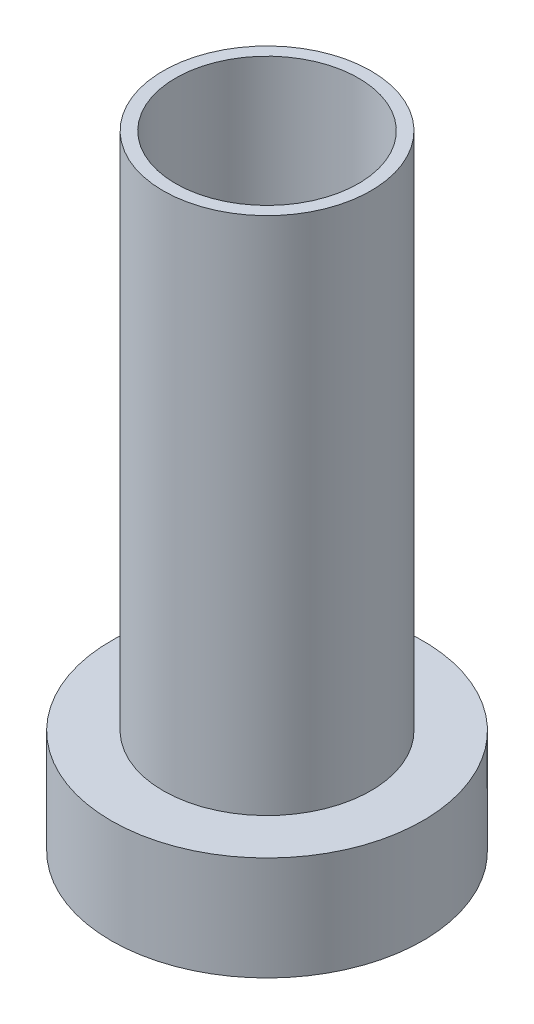
ISO-10303-21;
HEADER;
FILE_DESCRIPTION(('STEP AP214'),'2;1');
FILE_NAME('part.step','',(''),(''),'','','');
FILE_SCHEMA(('AUTOMOTIVE_DESIGN { 1 0 10303 214 1 1 1 1 }'));
ENDSEC;
DATA;
#1=APPLICATION_CONTEXT('core data for automotive mechanical design processes');
#2=APPLICATION_PROTOCOL_DEFINITION('international standard','automotive_design',2000,#1);
#3=PRODUCT_CONTEXT('',#1,'mechanical');
#4=PRODUCT('Part','Part','',(#3));
#5=PRODUCT_RELATED_PRODUCT_CATEGORY('part','',(#4));
#6=PRODUCT_DEFINITION_FORMATION('','',#4);
#7=PRODUCT_DEFINITION_CONTEXT('part definition',#1,'design');
#8=PRODUCT_DEFINITION('design','',#6,#7);
#9=PRODUCT_DEFINITION_SHAPE('','',#8);
#10=(LENGTH_UNIT() NAMED_UNIT(*) SI_UNIT(.MILLI.,.METRE.));
#11=(NAMED_UNIT(*) PLANE_ANGLE_UNIT() SI_UNIT($,.RADIAN.));
#12=(NAMED_UNIT(*) SI_UNIT($,.STERADIAN.) SOLID_ANGLE_UNIT());
#13=UNCERTAINTY_MEASURE_WITH_UNIT(LENGTH_MEASURE(1.E-05),#10,'distance_accuracy_value','');
#14=(GEOMETRIC_REPRESENTATION_CONTEXT(3) GLOBAL_UNCERTAINTY_ASSIGNED_CONTEXT((#13)) GLOBAL_UNIT_ASSIGNED_CONTEXT((#10,
#11,#12)) REPRESENTATION_CONTEXT('',''));
#15=CARTESIAN_POINT('',(0.,0.,0.));
#16=DIRECTION('',(0.,0.,1.));
#17=DIRECTION('',(1.,0.,0.));
#18=AXIS2_PLACEMENT_3D('',#15,#16,#17);
#19=CARTESIAN_POINT('',(0.,0.5,0.));
#20=DIRECTION('',(0.,1.,0.));
#21=DIRECTION('',(0.,0.,1.));
#22=AXIS2_PLACEMENT_3D('',#19,#20,#21);
#23=PLANE('',#22);
#24=CARTESIAN_POINT('',(0.,0.5,0.));
#25=DIRECTION('',(0.,1.,0.));
#26=DIRECTION('',(0.,0.,1.));
#27=AXIS2_PLACEMENT_3D('',#24,#25,#26);
#28=CIRCLE('',#27,0.315);
#29=CARTESIAN_POINT('',(0.,0.5,0.315));
#30=VERTEX_POINT('',#29);
#31=EDGE_CURVE('E48',#30,#30,#28,.T.);
#32=ORIENTED_EDGE('',*,*,#31,.F.);
#33=EDGE_LOOP('',(#32));
#34=FACE_BOUND('',#33,.T.);
#35=CARTESIAN_POINT('',(0.,0.5,0.));
#36=DIRECTION('',(0.,1.,0.));
#37=DIRECTION('',(0.,0.,1.));
#38=AXIS2_PLACEMENT_3D('',#35,#36,#37);
#39=CIRCLE('',#38,0.44);
#40=CARTESIAN_POINT('',(0.,0.5,0.44));
#41=VERTEX_POINT('',#40);
#42=EDGE_CURVE('E11',#41,#41,#39,.F.);
#43=ORIENTED_EDGE('',*,*,#42,.F.);
#44=EDGE_LOOP('',(#43));
#45=FACE_BOUND('',#44,.T.);
#46=ADVANCED_FACE('F37',(#34,#45),#23,.T.);
#47=CARTESIAN_POINT('',(0.,0.5,0.));
#48=DIRECTION('',(0.,-1.,0.));
#49=DIRECTION('',(0.,0.,-1.));
#50=AXIS2_PLACEMENT_3D('',#47,#48,#49);
#51=CYLINDRICAL_SURFACE('',#50,0.315);
#52=ORIENTED_EDGE('',*,*,#31,.T.);
#53=EDGE_LOOP('',(#52));
#54=FACE_BOUND('',#53,.T.);
#55=CARTESIAN_POINT('',(0.,0.,0.));
#56=DIRECTION('',(0.,1.,0.));
#57=DIRECTION('',(0.,0.,1.));
#58=AXIS2_PLACEMENT_3D('',#55,#56,#57);
#59=CIRCLE('',#58,0.315);
#60=CARTESIAN_POINT('',(0.,0.,0.315));
#61=VERTEX_POINT('',#60);
#62=EDGE_CURVE('E57',#61,#61,#59,.T.);
#63=ORIENTED_EDGE('',*,*,#62,.F.);
#64=EDGE_LOOP('',(#63));
#65=FACE_BOUND('',#64,.T.);
#66=ADVANCED_FACE('F39',(#54,#65),#51,.F.);
#67=CARTESIAN_POINT('',(0.,0.5,0.));
#68=DIRECTION('',(0.,-1.,0.));
#69=DIRECTION('',(0.,0.,-1.));
#70=AXIS2_PLACEMENT_3D('',#67,#68,#69);
#71=CYLINDRICAL_SURFACE('',#70,0.75);
#72=CARTESIAN_POINT('',(0.,0.5,0.));
#73=DIRECTION('',(0.,1.,0.));
#74=DIRECTION('',(0.,0.,1.));
#75=AXIS2_PLACEMENT_3D('',#72,#73,#74);
#76=CIRCLE('',#75,0.75);
#77=CARTESIAN_POINT('',(0.,0.5,0.75));
#78=VERTEX_POINT('',#77);
#79=EDGE_CURVE('E44',#78,#78,#76,.T.);
#80=ORIENTED_EDGE('',*,*,#79,.F.);
#81=EDGE_LOOP('',(#80));
#82=FACE_BOUND('',#81,.T.);
#83=CARTESIAN_POINT('',(0.,0.,0.));
#84=DIRECTION('',(0.,1.,0.));
#85=DIRECTION('',(0.,0.,1.));
#86=AXIS2_PLACEMENT_3D('',#83,#84,#85);
#87=CIRCLE('',#86,0.75);
#88=CARTESIAN_POINT('',(0.,0.,0.75));
#89=VERTEX_POINT('',#88);
#90=EDGE_CURVE('E53',#89,#89,#87,.T.);
#91=ORIENTED_EDGE('',*,*,#90,.T.);
#92=EDGE_LOOP('',(#91));
#93=FACE_BOUND('',#92,.T.);
#94=ADVANCED_FACE('F63',(#82,#93),#71,.T.);
#95=CARTESIAN_POINT('',(0.,0.5,0.));
#96=DIRECTION('',(0.,1.,0.));
#97=DIRECTION('',(0.,0.,1.));
#98=AXIS2_PLACEMENT_3D('',#95,#96,#97);
#99=CIRCLE('',#98,0.5);
#100=CARTESIAN_POINT('',(0.,0.5,0.5));
#101=VERTEX_POINT('',#100);
#102=EDGE_CURVE('E101',#101,#101,#99,.T.);
#103=ORIENTED_EDGE('',*,*,#102,.F.);
#104=EDGE_LOOP('',(#103));
#105=FACE_BOUND('',#104,.T.);
#106=ORIENTED_EDGE('',*,*,#79,.T.);
#107=EDGE_LOOP('',(#106));
#108=FACE_BOUND('',#107,.T.);
#109=ADVANCED_FACE('F68',(#105,#108),#23,.T.);
#110=CARTESIAN_POINT('',(0.,0.,0.));
#111=DIRECTION('',(0.,1.,0.));
#112=DIRECTION('',(0.,0.,1.));
#113=AXIS2_PLACEMENT_3D('',#110,#111,#112);
#114=PLANE('',#113);
#115=ORIENTED_EDGE('',*,*,#62,.T.);
#116=EDGE_LOOP('',(#115));
#117=FACE_BOUND('',#116,.T.);
#118=ORIENTED_EDGE('',*,*,#90,.F.);
#119=EDGE_LOOP('',(#118));
#120=FACE_BOUND('',#119,.T.);
#121=ADVANCED_FACE('F65',(#117,#120),#114,.F.);
#122=CARTESIAN_POINT('',(0.,3.,0.));
#123=DIRECTION('',(0.,1.,0.));
#124=DIRECTION('',(0.,0.,1.));
#125=AXIS2_PLACEMENT_3D('',#122,#123,#124);
#126=PLANE('',#125);
#127=CARTESIAN_POINT('',(0.,3.,0.));
#128=DIRECTION('',(0.,1.,0.));
#129=DIRECTION('',(0.,0.,1.));
#130=AXIS2_PLACEMENT_3D('',#127,#128,#129);
#131=CIRCLE('',#130,0.5);
#132=CARTESIAN_POINT('',(0.,3.,0.5));
#133=VERTEX_POINT('',#132);
#134=EDGE_CURVE('E59',#133,#133,#131,.T.);
#135=ORIENTED_EDGE('',*,*,#134,.T.);
#136=EDGE_LOOP('',(#135));
#137=FACE_BOUND('',#136,.T.);
#138=CARTESIAN_POINT('',(0.,3.,0.));
#139=DIRECTION('',(0.,1.,0.));
#140=DIRECTION('',(0.,0.,1.));
#141=AXIS2_PLACEMENT_3D('',#138,#139,#140);
#142=CIRCLE('',#141,0.44);
#143=CARTESIAN_POINT('',(0.,3.,0.44));
#144=VERTEX_POINT('',#143);
#145=EDGE_CURVE('E99',#144,#144,#142,.T.);
#146=ORIENTED_EDGE('',*,*,#145,.F.);
#147=EDGE_LOOP('',(#146));
#148=FACE_BOUND('',#147,.T.);
#149=ADVANCED_FACE('F67',(#137,#148),#126,.T.);
#150=CARTESIAN_POINT('',(0.,3.,0.));
#151=DIRECTION('',(0.,-1.,0.));
#152=DIRECTION('',(0.,0.,-1.));
#153=AXIS2_PLACEMENT_3D('',#150,#151,#152);
#154=CYLINDRICAL_SURFACE('',#153,0.5);
#155=ORIENTED_EDGE('',*,*,#134,.F.);
#156=EDGE_LOOP('',(#155));
#157=FACE_BOUND('',#156,.T.);
#158=ORIENTED_EDGE('',*,*,#102,.T.);
#159=EDGE_LOOP('',(#158));
#160=FACE_BOUND('',#159,.T.);
#161=ADVANCED_FACE('F75',(#157,#160),#154,.T.);
#162=CARTESIAN_POINT('',(0.,3.,0.));
#163=DIRECTION('',(0.,-1.,0.));
#164=DIRECTION('',(0.,0.,-1.));
#165=AXIS2_PLACEMENT_3D('',#162,#163,#164);
#166=CYLINDRICAL_SURFACE('',#165,0.44);
#167=ORIENTED_EDGE('',*,*,#145,.T.);
#168=EDGE_LOOP('',(#167));
#169=FACE_BOUND('',#168,.T.);
#170=ORIENTED_EDGE('',*,*,#42,.T.);
#171=EDGE_LOOP('',(#170));
#172=FACE_BOUND('',#171,.T.);
#173=ADVANCED_FACE('F90',(#169,#172),#166,.F.);
#174=CLOSED_SHELL('',(#46,#66,#94,#109,#121,#149,#161,#173));
#175=MANIFOLD_SOLID_BREP('B2',#174);
#176=ADVANCED_BREP_SHAPE_REPRESENTATION('',(#18,#175),#14);
#177=SHAPE_DEFINITION_REPRESENTATION(#9,#176);
ENDSEC;
END-ISO-10303-21;
